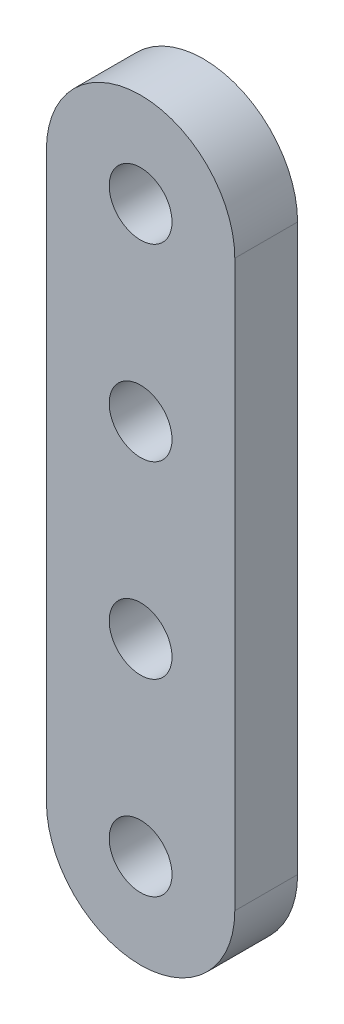
ISO-10303-21;
HEADER;
FILE_DESCRIPTION(('STEP AP214'),'2;1');
FILE_NAME('part.step','',(''),(''),'','','');
FILE_SCHEMA(('AUTOMOTIVE_DESIGN { 1 0 10303 214 1 1 1 1 }'));
ENDSEC;
DATA;
#1=APPLICATION_CONTEXT('core data for automotive mechanical design processes');
#2=APPLICATION_PROTOCOL_DEFINITION('international standard','automotive_design',2000,#1);
#3=PRODUCT_CONTEXT('',#1,'mechanical');
#4=PRODUCT('Part','Part','',(#3));
#5=PRODUCT_RELATED_PRODUCT_CATEGORY('part','',(#4));
#6=PRODUCT_DEFINITION_FORMATION('','',#4);
#7=PRODUCT_DEFINITION_CONTEXT('part definition',#1,'design');
#8=PRODUCT_DEFINITION('design','',#6,#7);
#9=PRODUCT_DEFINITION_SHAPE('','',#8);
#10=(LENGTH_UNIT() NAMED_UNIT(*) SI_UNIT(.MILLI.,.METRE.));
#11=(NAMED_UNIT(*) PLANE_ANGLE_UNIT() SI_UNIT($,.RADIAN.));
#12=(NAMED_UNIT(*) SI_UNIT($,.STERADIAN.) SOLID_ANGLE_UNIT());
#13=UNCERTAINTY_MEASURE_WITH_UNIT(LENGTH_MEASURE(1.E-05),#10,'distance_accuracy_value','');
#14=(GEOMETRIC_REPRESENTATION_CONTEXT(3) GLOBAL_UNCERTAINTY_ASSIGNED_CONTEXT((#13)) GLOBAL_UNIT_ASSIGNED_CONTEXT((#10,
#11,#12)) REPRESENTATION_CONTEXT('',''));
#15=CARTESIAN_POINT('',(0.,0.,0.));
#16=DIRECTION('',(0.,0.,1.));
#17=DIRECTION('',(1.,0.,0.));
#18=AXIS2_PLACEMENT_3D('',#15,#16,#17);
#19=CARTESIAN_POINT('',(208.7507761496,152.428489513,3.));
#20=DIRECTION('',(0.,0.,1.));
#21=DIRECTION('',(1.,0.,0.));
#22=AXIS2_PLACEMENT_3D('',#19,#20,#21);
#23=PLANE('',#22);
#24=CARTESIAN_POINT('',(208.7507761496,170.428489513,3.));
#25=DIRECTION('',(0.,0.,1.));
#26=DIRECTION('',(1.,0.,0.));
#27=AXIS2_PLACEMENT_3D('',#24,#25,#26);
#28=CIRCLE('',#27,1.5);
#29=CARTESIAN_POINT('',(210.2507761496,170.428489513,3.));
#30=VERTEX_POINT('',#29);
#31=EDGE_CURVE('E121',#30,#30,#28,.T.);
#32=ORIENTED_EDGE('',*,*,#31,.F.);
#33=EDGE_LOOP('',(#32));
#34=FACE_BOUND('',#33,.T.);
#35=CARTESIAN_POINT('',(208.7507761496,152.428489513,3.));
#36=DIRECTION('',(0.,0.,1.));
#37=DIRECTION('',(1.,0.,0.));
#38=AXIS2_PLACEMENT_3D('',#35,#36,#37);
#39=CIRCLE('',#38,1.5);
#40=CARTESIAN_POINT('',(210.2507761496,152.428489513,3.));
#41=VERTEX_POINT('',#40);
#42=EDGE_CURVE('E100',#41,#41,#39,.T.);
#43=ORIENTED_EDGE('',*,*,#42,.F.);
#44=EDGE_LOOP('',(#43));
#45=FACE_BOUND('',#44,.T.);
#46=CARTESIAN_POINT('',(208.7507761496,152.428489513,3.));
#47=DIRECTION('',(0.,0.,1.));
#48=DIRECTION('',(1.,0.,0.));
#49=AXIS2_PLACEMENT_3D('',#46,#47,#48);
#50=CIRCLE('',#49,4.5);
#51=CARTESIAN_POINT('',(204.2507761496,152.428489513,3.));
#52=VERTEX_POINT('',#51);
#53=CARTESIAN_POINT('',(213.2507761496,152.428489513,3.));
#54=VERTEX_POINT('',#53);
#55=EDGE_CURVE('E85',#52,#54,#50,.T.);
#56=ORIENTED_EDGE('',*,*,#55,.T.);
#57=DIRECTION('',(0.,1.,0.));
#58=VECTOR('',#57,1.);
#59=CARTESIAN_POINT('',(213.2507761496,152.428489513,3.));
#60=LINE('',#59,#58);
#61=CARTESIAN_POINT('',(213.2507761496,179.428489513,3.));
#62=VERTEX_POINT('',#61);
#63=EDGE_CURVE('E80',#54,#62,#60,.T.);
#64=ORIENTED_EDGE('',*,*,#63,.T.);
#65=CARTESIAN_POINT('',(208.7507761496,179.428489513,3.));
#66=DIRECTION('',(0.,0.,1.));
#67=DIRECTION('',(1.,0.,0.));
#68=AXIS2_PLACEMENT_3D('',#65,#66,#67);
#69=CIRCLE('',#68,4.5);
#70=CARTESIAN_POINT('',(204.2507761496,179.428489513,3.));
#71=VERTEX_POINT('',#70);
#72=EDGE_CURVE('E83',#62,#71,#69,.T.);
#73=ORIENTED_EDGE('',*,*,#72,.T.);
#74=DIRECTION('',(0.,-1.,0.));
#75=VECTOR('',#74,1.);
#76=CARTESIAN_POINT('',(204.2507761496,179.428489513,3.));
#77=LINE('',#76,#75);
#78=EDGE_CURVE('E50',#71,#52,#77,.T.);
#79=ORIENTED_EDGE('',*,*,#78,.T.);
#80=EDGE_LOOP('',(#56,#64,#73,#79));
#81=FACE_BOUND('',#80,.T.);
#82=CARTESIAN_POINT('',(208.7507761496,161.428489513,3.));
#83=DIRECTION('',(0.,0.,1.));
#84=DIRECTION('',(1.,0.,0.));
#85=AXIS2_PLACEMENT_3D('',#82,#83,#84);
#86=CIRCLE('',#85,1.5);
#87=CARTESIAN_POINT('',(210.2507761496,161.428489513,3.));
#88=VERTEX_POINT('',#87);
#89=EDGE_CURVE('E115',#88,#88,#86,.T.);
#90=ORIENTED_EDGE('',*,*,#89,.F.);
#91=EDGE_LOOP('',(#90));
#92=FACE_BOUND('',#91,.T.);
#93=CARTESIAN_POINT('',(208.7507761496,179.428489513,3.));
#94=DIRECTION('',(0.,0.,1.));
#95=DIRECTION('',(1.,0.,0.));
#96=AXIS2_PLACEMENT_3D('',#93,#94,#95);
#97=CIRCLE('',#96,1.5);
#98=CARTESIAN_POINT('',(210.2507761496,179.428489513,3.));
#99=VERTEX_POINT('',#98);
#100=EDGE_CURVE('E127',#99,#99,#97,.T.);
#101=ORIENTED_EDGE('',*,*,#100,.F.);
#102=EDGE_LOOP('',(#101));
#103=FACE_BOUND('',#102,.T.);
#104=ADVANCED_FACE('F33',(#34,#45,#81,#92,#103),#23,.T.);
#105=CARTESIAN_POINT('',(208.7507761496,152.428489513,0.));
#106=DIRECTION('',(0.,0.,1.));
#107=DIRECTION('',(1.,0.,0.));
#108=AXIS2_PLACEMENT_3D('',#105,#106,#107);
#109=PLANE('',#108);
#110=CARTESIAN_POINT('',(208.7507761496,170.428489513,0.));
#111=DIRECTION('',(0.,0.,1.));
#112=DIRECTION('',(1.,0.,0.));
#113=AXIS2_PLACEMENT_3D('',#110,#111,#112);
#114=CIRCLE('',#113,1.5);
#115=CARTESIAN_POINT('',(210.2507761496,170.428489513,0.));
#116=VERTEX_POINT('',#115);
#117=EDGE_CURVE('E124',#116,#116,#114,.T.);
#118=ORIENTED_EDGE('',*,*,#117,.T.);
#119=EDGE_LOOP('',(#118));
#120=FACE_BOUND('',#119,.T.);
#121=CARTESIAN_POINT('',(208.7507761496,152.428489513,0.));
#122=DIRECTION('',(0.,0.,1.));
#123=DIRECTION('',(1.,0.,0.));
#124=AXIS2_PLACEMENT_3D('',#121,#122,#123);
#125=CIRCLE('',#124,1.5);
#126=CARTESIAN_POINT('',(210.2507761496,152.428489513,0.));
#127=VERTEX_POINT('',#126);
#128=EDGE_CURVE('E112',#127,#127,#125,.T.);
#129=ORIENTED_EDGE('',*,*,#128,.T.);
#130=EDGE_LOOP('',(#129));
#131=FACE_BOUND('',#130,.T.);
#132=CARTESIAN_POINT('',(208.7507761496,152.428489513,0.));
#133=DIRECTION('',(0.,0.,1.));
#134=DIRECTION('',(1.,0.,0.));
#135=AXIS2_PLACEMENT_3D('',#132,#133,#134);
#136=CIRCLE('',#135,4.5);
#137=CARTESIAN_POINT('',(204.2507761496,152.428489513,0.));
#138=VERTEX_POINT('',#137);
#139=CARTESIAN_POINT('',(213.2507761496,152.428489513,0.));
#140=VERTEX_POINT('',#139);
#141=EDGE_CURVE('E97',#138,#140,#136,.T.);
#142=ORIENTED_EDGE('',*,*,#141,.F.);
#143=DIRECTION('',(0.,-1.,0.));
#144=VECTOR('',#143,1.);
#145=CARTESIAN_POINT('',(204.2507761496,179.428489513,0.));
#146=LINE('',#145,#144);
#147=CARTESIAN_POINT('',(204.2507761496,179.428489513,0.));
#148=VERTEX_POINT('',#147);
#149=EDGE_CURVE('E73',#148,#138,#146,.T.);
#150=ORIENTED_EDGE('',*,*,#149,.F.);
#151=CARTESIAN_POINT('',(208.7507761496,179.428489513,0.));
#152=DIRECTION('',(0.,0.,1.));
#153=DIRECTION('',(1.,0.,0.));
#154=AXIS2_PLACEMENT_3D('',#151,#152,#153);
#155=CIRCLE('',#154,4.5);
#156=CARTESIAN_POINT('',(213.2507761496,179.428489513,0.));
#157=VERTEX_POINT('',#156);
#158=EDGE_CURVE('E67',#157,#148,#155,.T.);
#159=ORIENTED_EDGE('',*,*,#158,.F.);
#160=DIRECTION('',(0.,1.,0.));
#161=VECTOR('',#160,1.);
#162=CARTESIAN_POINT('',(213.2507761496,152.428489513,0.));
#163=LINE('',#162,#161);
#164=EDGE_CURVE('E89',#140,#157,#163,.T.);
#165=ORIENTED_EDGE('',*,*,#164,.F.);
#166=EDGE_LOOP('',(#142,#150,#159,#165));
#167=FACE_BOUND('',#166,.T.);
#168=CARTESIAN_POINT('',(208.7507761496,161.428489513,0.));
#169=DIRECTION('',(0.,0.,1.));
#170=DIRECTION('',(1.,0.,0.));
#171=AXIS2_PLACEMENT_3D('',#168,#169,#170);
#172=CIRCLE('',#171,1.5);
#173=CARTESIAN_POINT('',(210.2507761496,161.428489513,0.));
#174=VERTEX_POINT('',#173);
#175=EDGE_CURVE('E118',#174,#174,#172,.T.);
#176=ORIENTED_EDGE('',*,*,#175,.T.);
#177=EDGE_LOOP('',(#176));
#178=FACE_BOUND('',#177,.T.);
#179=CARTESIAN_POINT('',(208.7507761496,179.428489513,0.));
#180=DIRECTION('',(0.,0.,1.));
#181=DIRECTION('',(1.,0.,0.));
#182=AXIS2_PLACEMENT_3D('',#179,#180,#181);
#183=CIRCLE('',#182,1.5);
#184=CARTESIAN_POINT('',(210.2507761496,179.428489513,0.));
#185=VERTEX_POINT('',#184);
#186=EDGE_CURVE('E130',#185,#185,#183,.T.);
#187=ORIENTED_EDGE('',*,*,#186,.T.);
#188=EDGE_LOOP('',(#187));
#189=FACE_BOUND('',#188,.T.);
#190=ADVANCED_FACE('F108',(#120,#131,#167,#178,#189),#109,.F.);
#191=CARTESIAN_POINT('',(208.7507761496,152.428489513,3.));
#192=DIRECTION('',(0.,0.,-1.));
#193=DIRECTION('',(-1.,0.,0.));
#194=AXIS2_PLACEMENT_3D('',#191,#192,#193);
#195=CYLINDRICAL_SURFACE('',#194,4.5);
#196=ORIENTED_EDGE('',*,*,#141,.T.);
#197=DIRECTION('',(0.,0.,-1.));
#198=VECTOR('',#197,1.);
#199=CARTESIAN_POINT('',(213.2507761496,152.428489513,3.));
#200=LINE('',#199,#198);
#201=EDGE_CURVE('E11',#54,#140,#200,.T.);
#202=ORIENTED_EDGE('',*,*,#201,.F.);
#203=ORIENTED_EDGE('',*,*,#55,.F.);
#204=DIRECTION('',(0.,0.,-1.));
#205=VECTOR('',#204,1.);
#206=CARTESIAN_POINT('',(204.2507761496,152.428489513,3.));
#207=LINE('',#206,#205);
#208=EDGE_CURVE('E93',#52,#138,#207,.T.);
#209=ORIENTED_EDGE('',*,*,#208,.T.);
#210=EDGE_LOOP('',(#196,#202,#203,#209));
#211=FACE_BOUND('',#210,.T.);
#212=ADVANCED_FACE('F35',(#211),#195,.T.);
#213=CARTESIAN_POINT('',(213.2507761496,152.428489513,3.));
#214=DIRECTION('',(-1.,0.,0.));
#215=DIRECTION('',(0.,0.,1.));
#216=AXIS2_PLACEMENT_3D('',#213,#214,#215);
#217=PLANE('',#216);
#218=ORIENTED_EDGE('',*,*,#164,.T.);
#219=DIRECTION('',(0.,0.,-1.));
#220=VECTOR('',#219,1.);
#221=CARTESIAN_POINT('',(213.2507761496,179.428489513,3.));
#222=LINE('',#221,#220);
#223=EDGE_CURVE('E42',#62,#157,#222,.T.);
#224=ORIENTED_EDGE('',*,*,#223,.F.);
#225=ORIENTED_EDGE('',*,*,#63,.F.);
#226=ORIENTED_EDGE('',*,*,#201,.T.);
#227=EDGE_LOOP('',(#218,#224,#225,#226));
#228=FACE_BOUND('',#227,.T.);
#229=ADVANCED_FACE('F88',(#228),#217,.F.);
#230=CARTESIAN_POINT('',(208.7507761496,179.428489513,3.));
#231=DIRECTION('',(0.,0.,-1.));
#232=DIRECTION('',(-1.,0.,0.));
#233=AXIS2_PLACEMENT_3D('',#230,#231,#232);
#234=CYLINDRICAL_SURFACE('',#233,4.5);
#235=ORIENTED_EDGE('',*,*,#158,.T.);
#236=DIRECTION('',(0.,0.,-1.));
#237=VECTOR('',#236,1.);
#238=CARTESIAN_POINT('',(204.2507761496,179.428489513,3.));
#239=LINE('',#238,#237);
#240=EDGE_CURVE('E90',#71,#148,#239,.T.);
#241=ORIENTED_EDGE('',*,*,#240,.F.);
#242=ORIENTED_EDGE('',*,*,#72,.F.);
#243=ORIENTED_EDGE('',*,*,#223,.T.);
#244=EDGE_LOOP('',(#235,#241,#242,#243));
#245=FACE_BOUND('',#244,.T.);
#246=ADVANCED_FACE('F91',(#245),#234,.T.);
#247=CARTESIAN_POINT('',(204.2507761496,179.428489513,3.));
#248=DIRECTION('',(1.,0.,0.));
#249=DIRECTION('',(0.,0.,-1.));
#250=AXIS2_PLACEMENT_3D('',#247,#248,#249);
#251=PLANE('',#250);
#252=ORIENTED_EDGE('',*,*,#149,.T.);
#253=ORIENTED_EDGE('',*,*,#208,.F.);
#254=ORIENTED_EDGE('',*,*,#78,.F.);
#255=ORIENTED_EDGE('',*,*,#240,.T.);
#256=EDGE_LOOP('',(#252,#253,#254,#255));
#257=FACE_BOUND('',#256,.T.);
#258=ADVANCED_FACE('F105',(#257),#251,.F.);
#259=CARTESIAN_POINT('',(208.7507761496,152.428489513,3.));
#260=DIRECTION('',(0.,0.,-1.));
#261=DIRECTION('',(-1.,0.,0.));
#262=AXIS2_PLACEMENT_3D('',#259,#260,#261);
#263=CYLINDRICAL_SURFACE('',#262,1.5);
#264=ORIENTED_EDGE('',*,*,#42,.T.);
#265=EDGE_LOOP('',(#264));
#266=FACE_BOUND('',#265,.T.);
#267=ORIENTED_EDGE('',*,*,#128,.F.);
#268=EDGE_LOOP('',(#267));
#269=FACE_BOUND('',#268,.T.);
#270=ADVANCED_FACE('F150',(#266,#269),#263,.F.);
#271=CARTESIAN_POINT('',(208.7507761496,161.428489513,3.));
#272=DIRECTION('',(0.,0.,-1.));
#273=DIRECTION('',(-1.,0.,0.));
#274=AXIS2_PLACEMENT_3D('',#271,#272,#273);
#275=CYLINDRICAL_SURFACE('',#274,1.5);
#276=ORIENTED_EDGE('',*,*,#89,.T.);
#277=EDGE_LOOP('',(#276));
#278=FACE_BOUND('',#277,.T.);
#279=ORIENTED_EDGE('',*,*,#175,.F.);
#280=EDGE_LOOP('',(#279));
#281=FACE_BOUND('',#280,.T.);
#282=ADVANCED_FACE('F196',(#278,#281),#275,.F.);
#283=CARTESIAN_POINT('',(208.7507761496,170.428489513,3.));
#284=DIRECTION('',(0.,0.,-1.));
#285=DIRECTION('',(-1.,0.,0.));
#286=AXIS2_PLACEMENT_3D('',#283,#284,#285);
#287=CYLINDRICAL_SURFACE('',#286,1.5);
#288=ORIENTED_EDGE('',*,*,#31,.T.);
#289=EDGE_LOOP('',(#288));
#290=FACE_BOUND('',#289,.T.);
#291=ORIENTED_EDGE('',*,*,#117,.F.);
#292=EDGE_LOOP('',(#291));
#293=FACE_BOUND('',#292,.T.);
#294=ADVANCED_FACE('F204',(#290,#293),#287,.F.);
#295=CARTESIAN_POINT('',(208.7507761496,179.428489513,3.));
#296=DIRECTION('',(0.,0.,-1.));
#297=DIRECTION('',(-1.,0.,0.));
#298=AXIS2_PLACEMENT_3D('',#295,#296,#297);
#299=CYLINDRICAL_SURFACE('',#298,1.5);
#300=ORIENTED_EDGE('',*,*,#100,.T.);
#301=EDGE_LOOP('',(#300));
#302=FACE_BOUND('',#301,.T.);
#303=ORIENTED_EDGE('',*,*,#186,.F.);
#304=EDGE_LOOP('',(#303));
#305=FACE_BOUND('',#304,.T.);
#306=ADVANCED_FACE('F136',(#302,#305),#299,.F.);
#307=CLOSED_SHELL('',(#104,#190,#212,#229,#246,#258,#270,#282,#294,#306));
#308=MANIFOLD_SOLID_BREP('B2',#307);
#309=ADVANCED_BREP_SHAPE_REPRESENTATION('',(#18,#308),#14);
#310=SHAPE_DEFINITION_REPRESENTATION(#9,#309);
ENDSEC;
END-ISO-10303-21;
